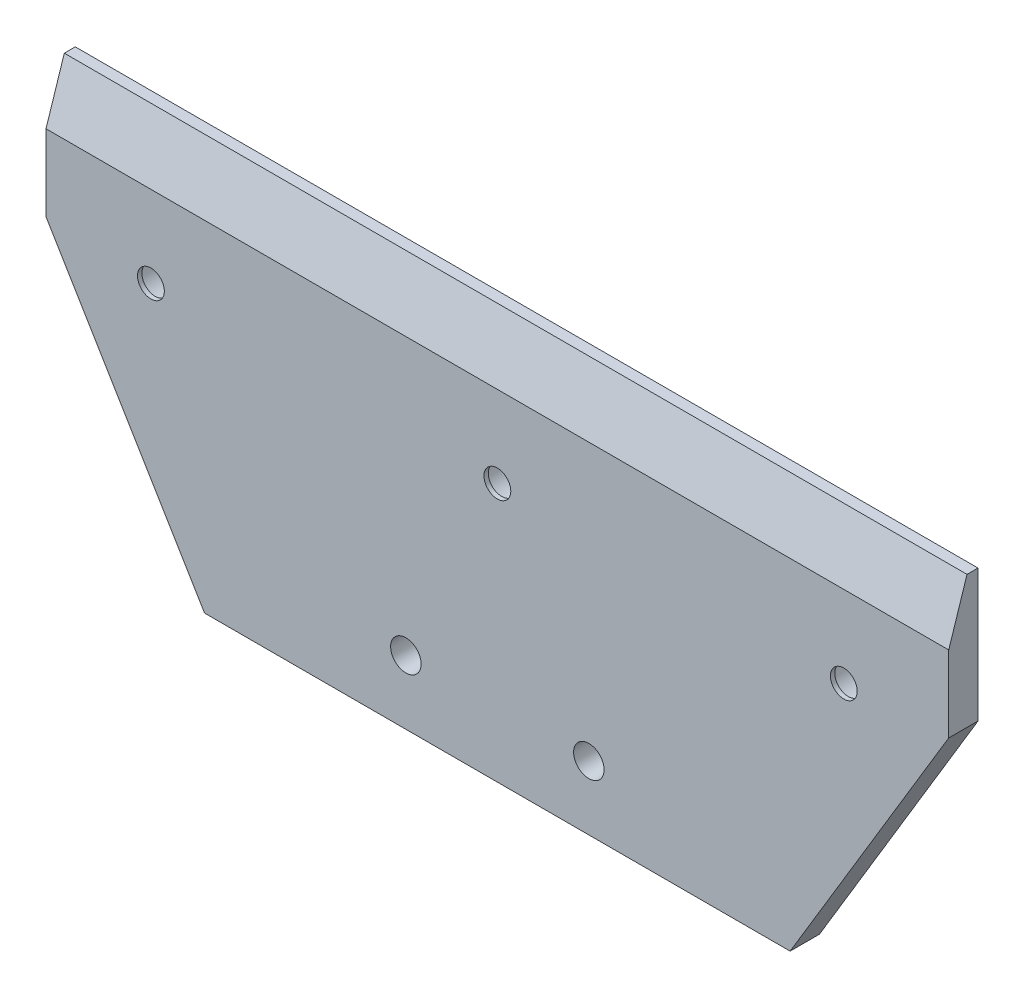
ISO-10303-21;
HEADER;
FILE_DESCRIPTION(('STEP AP214'),'2;1');
FILE_NAME('part.step','',(''),(''),'','','');
FILE_SCHEMA(('AUTOMOTIVE_DESIGN { 1 0 10303 214 1 1 1 1 }'));
ENDSEC;
DATA;
#1=APPLICATION_CONTEXT('core data for automotive mechanical design processes');
#2=APPLICATION_PROTOCOL_DEFINITION('international standard','automotive_design',2000,#1);
#3=PRODUCT_CONTEXT('',#1,'mechanical');
#4=PRODUCT('Part','Part','',(#3));
#5=PRODUCT_RELATED_PRODUCT_CATEGORY('part','',(#4));
#6=PRODUCT_DEFINITION_FORMATION('','',#4);
#7=PRODUCT_DEFINITION_CONTEXT('part definition',#1,'design');
#8=PRODUCT_DEFINITION('design','',#6,#7);
#9=PRODUCT_DEFINITION_SHAPE('','',#8);
#10=(LENGTH_UNIT() NAMED_UNIT(*) SI_UNIT(.MILLI.,.METRE.));
#11=(NAMED_UNIT(*) PLANE_ANGLE_UNIT() SI_UNIT($,.RADIAN.));
#12=(NAMED_UNIT(*) SI_UNIT($,.STERADIAN.) SOLID_ANGLE_UNIT());
#13=UNCERTAINTY_MEASURE_WITH_UNIT(LENGTH_MEASURE(1.E-05),#10,'distance_accuracy_value','');
#14=(GEOMETRIC_REPRESENTATION_CONTEXT(3) GLOBAL_UNCERTAINTY_ASSIGNED_CONTEXT((#13)) GLOBAL_UNIT_ASSIGNED_CONTEXT((#10,
#11,#12)) REPRESENTATION_CONTEXT('',''));
#15=CARTESIAN_POINT('',(0.,0.,0.));
#16=DIRECTION('',(0.,0.,1.));
#17=DIRECTION('',(1.,0.,0.));
#18=AXIS2_PLACEMENT_3D('',#15,#16,#17);
#19=CARTESIAN_POINT('',(0.,0.,-1.2));
#20=DIRECTION('',(0.,0.,1.));
#21=DIRECTION('',(1.,0.,0.));
#22=AXIS2_PLACEMENT_3D('',#19,#20,#21);
#23=PLANE('',#22);
#24=CARTESIAN_POINT('',(28.4,21.2,-1.2));
#25=DIRECTION('',(0.,0.,-1.));
#26=DIRECTION('',(-1.,0.,0.));
#27=AXIS2_PLACEMENT_3D('',#24,#25,#26);
#28=CIRCLE('',#27,2.);
#29=CARTESIAN_POINT('',(26.4,21.2,-1.2));
#30=VERTEX_POINT('',#29);
#31=EDGE_CURVE('E255',#30,#30,#28,.T.);
#32=ORIENTED_EDGE('',*,*,#31,.F.);
#33=EDGE_LOOP('',(#32));
#34=FACE_BOUND('',#33,.T.);
#35=CARTESIAN_POINT('',(-28.4,21.2,-1.2));
#36=DIRECTION('',(0.,0.,-1.));
#37=DIRECTION('',(-1.,0.,0.));
#38=AXIS2_PLACEMENT_3D('',#35,#36,#37);
#39=CIRCLE('',#38,2.);
#40=CARTESIAN_POINT('',(-30.4,21.2,-1.2));
#41=VERTEX_POINT('',#40);
#42=EDGE_CURVE('E235',#41,#41,#39,.T.);
#43=ORIENTED_EDGE('',*,*,#42,.F.);
#44=EDGE_LOOP('',(#43));
#45=FACE_BOUND('',#44,.T.);
#46=CARTESIAN_POINT('',(-7.5,5.25,-1.2));
#47=DIRECTION('',(0.,0.,1.));
#48=DIRECTION('',(1.,0.,0.));
#49=AXIS2_PLACEMENT_3D('',#46,#47,#48);
#50=CIRCLE('',#49,1.25);
#51=CARTESIAN_POINT('',(-6.25,5.25,-1.2));
#52=VERTEX_POINT('',#51);
#53=EDGE_CURVE('E44',#52,#52,#50,.T.);
#54=ORIENTED_EDGE('',*,*,#53,.T.);
#55=EDGE_LOOP('',(#54));
#56=FACE_BOUND('',#55,.T.);
#57=CARTESIAN_POINT('',(7.5,5.25,-1.2));
#58=DIRECTION('',(0.,0.,1.));
#59=DIRECTION('',(1.,0.,0.));
#60=AXIS2_PLACEMENT_3D('',#57,#58,#59);
#61=CIRCLE('',#60,1.25);
#62=CARTESIAN_POINT('',(8.75,5.25,-1.2));
#63=VERTEX_POINT('',#62);
#64=EDGE_CURVE('E220',#63,#63,#61,.T.);
#65=ORIENTED_EDGE('',*,*,#64,.T.);
#66=EDGE_LOOP('',(#65));
#67=FACE_BOUND('',#66,.T.);
#68=DIRECTION('',(0.515038074910052,-0.857167300702114,0.));
#69=VECTOR('',#68,1.);
#70=CARTESIAN_POINT('',(-37.,21.6356332705569,-1.2));
#71=LINE('',#70,#69);
#72=CARTESIAN_POINT('',(-37.,21.6356332705569,-1.2));
#73=VERTEX_POINT('',#72);
#74=CARTESIAN_POINT('',(-24.,0.,-1.2));
#75=VERTEX_POINT('',#74);
#76=EDGE_CURVE('E113',#73,#75,#71,.T.);
#77=ORIENTED_EDGE('',*,*,#76,.F.);
#78=DIRECTION('',(0.,-1.,0.));
#79=VECTOR('',#78,1.);
#80=CARTESIAN_POINT('',(-37.,32.5,-1.2));
#81=LINE('',#80,#79);
#82=CARTESIAN_POINT('',(-37.,32.5,-1.2));
#83=VERTEX_POINT('',#82);
#84=EDGE_CURVE('E91',#83,#73,#81,.T.);
#85=ORIENTED_EDGE('',*,*,#84,.F.);
#86=DIRECTION('',(-1.,0.,0.));
#87=VECTOR('',#86,1.);
#88=CARTESIAN_POINT('',(37.,32.5,-1.2));
#89=LINE('',#88,#87);
#90=CARTESIAN_POINT('',(37.,32.5,-1.2));
#91=VERTEX_POINT('',#90);
#92=EDGE_CURVE('E122',#91,#83,#89,.T.);
#93=ORIENTED_EDGE('',*,*,#92,.F.);
#94=DIRECTION('',(0.,1.,0.));
#95=VECTOR('',#94,1.);
#96=CARTESIAN_POINT('',(37.,21.6356332705569,-1.2));
#97=LINE('',#96,#95);
#98=CARTESIAN_POINT('',(37.,21.6356332705569,-1.2));
#99=VERTEX_POINT('',#98);
#100=EDGE_CURVE('E147',#99,#91,#97,.T.);
#101=ORIENTED_EDGE('',*,*,#100,.F.);
#102=DIRECTION('',(0.515038074910052,0.857167300702114,0.));
#103=VECTOR('',#102,1.);
#104=CARTESIAN_POINT('',(24.,0.,-1.2));
#105=LINE('',#104,#103);
#106=CARTESIAN_POINT('',(24.,0.,-1.2));
#107=VERTEX_POINT('',#106);
#108=EDGE_CURVE('E139',#107,#99,#105,.T.);
#109=ORIENTED_EDGE('',*,*,#108,.F.);
#110=DIRECTION('',(1.,0.,0.));
#111=VECTOR('',#110,1.);
#112=CARTESIAN_POINT('',(-24.,0.,-1.2));
#113=LINE('',#112,#111);
#114=EDGE_CURVE('E145',#75,#107,#113,.T.);
#115=ORIENTED_EDGE('',*,*,#114,.F.);
#116=EDGE_LOOP('',(#77,#85,#93,#101,#109,#115));
#117=FACE_BOUND('',#116,.T.);
#118=CARTESIAN_POINT('',(0.,21.2,-1.2));
#119=DIRECTION('',(0.,0.,-1.));
#120=DIRECTION('',(-1.,0.,0.));
#121=AXIS2_PLACEMENT_3D('',#118,#119,#120);
#122=CIRCLE('',#121,2.);
#123=CARTESIAN_POINT('',(-2.,21.2,-1.2));
#124=VERTEX_POINT('',#123);
#125=EDGE_CURVE('E245',#124,#124,#122,.T.);
#126=ORIENTED_EDGE('',*,*,#125,.F.);
#127=EDGE_LOOP('',(#126));
#128=FACE_BOUND('',#127,.T.);
#129=ADVANCED_FACE('F40',(#34,#45,#56,#67,#117,#128),#23,.F.);
#130=CARTESIAN_POINT('',(-37.,21.6356332705569,1.2));
#131=DIRECTION('',(0.857167300702114,0.515038074910052,0.));
#132=DIRECTION('',(-0.515038074910052,0.857167300702114,0.));
#133=AXIS2_PLACEMENT_3D('',#130,#131,#132);
#134=PLANE('',#133);
#135=ORIENTED_EDGE('',*,*,#76,.T.);
#136=DIRECTION('',(0.,0.,-1.));
#137=VECTOR('',#136,1.);
#138=CARTESIAN_POINT('',(-24.,0.,1.2));
#139=LINE('',#138,#137);
#140=CARTESIAN_POINT('',(-24.,0.,1.2));
#141=VERTEX_POINT('',#140);
#142=EDGE_CURVE('E11',#141,#75,#139,.T.);
#143=ORIENTED_EDGE('',*,*,#142,.F.);
#144=DIRECTION('',(0.515038074910052,-0.857167300702114,0.));
#145=VECTOR('',#144,1.);
#146=CARTESIAN_POINT('',(-37.,21.6356332705569,1.2));
#147=LINE('',#146,#145);
#148=CARTESIAN_POINT('',(-37.,21.6356332705569,1.2));
#149=VERTEX_POINT('',#148);
#150=EDGE_CURVE('E153',#149,#141,#147,.T.);
#151=ORIENTED_EDGE('',*,*,#150,.F.);
#152=DIRECTION('',(0.,0.,-1.));
#153=VECTOR('',#152,1.);
#154=CARTESIAN_POINT('',(-37.,21.6356332705569,1.2));
#155=LINE('',#154,#153);
#156=EDGE_CURVE('E124',#149,#73,#155,.T.);
#157=ORIENTED_EDGE('',*,*,#156,.T.);
#158=EDGE_LOOP('',(#135,#143,#151,#157));
#159=FACE_BOUND('',#158,.T.);
#160=ADVANCED_FACE('F42',(#159),#134,.F.);
#161=CARTESIAN_POINT('',(-24.,0.,1.2));
#162=DIRECTION('',(0.,1.,0.));
#163=DIRECTION('',(-1.,0.,0.));
#164=AXIS2_PLACEMENT_3D('',#161,#162,#163);
#165=PLANE('',#164);
#166=ORIENTED_EDGE('',*,*,#114,.T.);
#167=DIRECTION('',(0.,0.,-1.));
#168=VECTOR('',#167,1.);
#169=CARTESIAN_POINT('',(24.,0.,1.2));
#170=LINE('',#169,#168);
#171=CARTESIAN_POINT('',(24.,0.,1.2));
#172=VERTEX_POINT('',#171);
#173=EDGE_CURVE('E49',#172,#107,#170,.T.);
#174=ORIENTED_EDGE('',*,*,#173,.F.);
#175=DIRECTION('',(1.,0.,0.));
#176=VECTOR('',#175,1.);
#177=CARTESIAN_POINT('',(-24.,0.,1.2));
#178=LINE('',#177,#176);
#179=EDGE_CURVE('E98',#141,#172,#178,.T.);
#180=ORIENTED_EDGE('',*,*,#179,.F.);
#181=ORIENTED_EDGE('',*,*,#142,.T.);
#182=EDGE_LOOP('',(#166,#174,#180,#181));
#183=FACE_BOUND('',#182,.T.);
#184=ADVANCED_FACE('F166',(#183),#165,.F.);
#185=CARTESIAN_POINT('',(24.,0.,1.2));
#186=DIRECTION('',(-0.857167300702113,0.515038074910052,0.));
#187=DIRECTION('',(-0.515038074910052,-0.857167300702114,0.));
#188=AXIS2_PLACEMENT_3D('',#185,#186,#187);
#189=PLANE('',#188);
#190=ORIENTED_EDGE('',*,*,#108,.T.);
#191=DIRECTION('',(0.,0.,-1.));
#192=VECTOR('',#191,1.);
#193=CARTESIAN_POINT('',(37.,21.6356332705569,1.2));
#194=LINE('',#193,#192);
#195=CARTESIAN_POINT('',(37.,21.6356332705569,1.2));
#196=VERTEX_POINT('',#195);
#197=EDGE_CURVE('E126',#196,#99,#194,.T.);
#198=ORIENTED_EDGE('',*,*,#197,.F.);
#199=DIRECTION('',(0.515038074910052,0.857167300702114,0.));
#200=VECTOR('',#199,1.);
#201=CARTESIAN_POINT('',(24.,0.,1.2));
#202=LINE('',#201,#200);
#203=EDGE_CURVE('E140',#172,#196,#202,.T.);
#204=ORIENTED_EDGE('',*,*,#203,.F.);
#205=ORIENTED_EDGE('',*,*,#173,.T.);
#206=EDGE_LOOP('',(#190,#198,#204,#205));
#207=FACE_BOUND('',#206,.T.);
#208=ADVANCED_FACE('F137',(#207),#189,.F.);
#209=CARTESIAN_POINT('',(37.,21.6356332705569,1.2));
#210=DIRECTION('',(-1.,0.,0.));
#211=DIRECTION('',(0.,0.,1.));
#212=AXIS2_PLACEMENT_3D('',#209,#210,#211);
#213=PLANE('',#212);
#214=DIRECTION('',(0.,0.,-1.));
#215=VECTOR('',#214,1.);
#216=CARTESIAN_POINT('',(37.,32.5,1.2));
#217=LINE('',#216,#215);
#218=CARTESIAN_POINT('',(37.,32.5,-0.3));
#219=VERTEX_POINT('',#218);
#220=EDGE_CURVE('E123',#219,#91,#217,.T.);
#221=ORIENTED_EDGE('',*,*,#220,.F.);
#222=DIRECTION('',(0.,0.951056516295155,-0.309016994374942));
#223=VECTOR('',#222,1.);
#224=CARTESIAN_POINT('',(37.,27.883474694237,1.2));
#225=LINE('',#224,#223);
#226=CARTESIAN_POINT('',(37.,27.883474694237,1.2));
#227=VERTEX_POINT('',#226);
#228=EDGE_CURVE('E109',#227,#219,#225,.T.);
#229=ORIENTED_EDGE('',*,*,#228,.F.);
#230=DIRECTION('',(0.,1.,0.));
#231=VECTOR('',#230,1.);
#232=CARTESIAN_POINT('',(37.,21.6356332705569,1.2));
#233=LINE('',#232,#231);
#234=EDGE_CURVE('E161',#196,#227,#233,.T.);
#235=ORIENTED_EDGE('',*,*,#234,.F.);
#236=ORIENTED_EDGE('',*,*,#197,.T.);
#237=ORIENTED_EDGE('',*,*,#100,.T.);
#238=EDGE_LOOP('',(#221,#229,#235,#236,#237));
#239=FACE_BOUND('',#238,.T.);
#240=ADVANCED_FACE('F172',(#239),#213,.F.);
#241=CARTESIAN_POINT('',(37.,32.5,1.2));
#242=DIRECTION('',(0.,-1.,0.));
#243=DIRECTION('',(1.,0.,0.));
#244=AXIS2_PLACEMENT_3D('',#241,#242,#243);
#245=PLANE('',#244);
#246=DIRECTION('',(0.,0.,-1.));
#247=VECTOR('',#246,1.);
#248=CARTESIAN_POINT('',(-37.,32.5,1.2));
#249=LINE('',#248,#247);
#250=CARTESIAN_POINT('',(-37.,32.5,-0.3));
#251=VERTEX_POINT('',#250);
#252=EDGE_CURVE('E117',#251,#83,#249,.T.);
#253=ORIENTED_EDGE('',*,*,#252,.F.);
#254=DIRECTION('',(1.,0.,0.));
#255=VECTOR('',#254,1.);
#256=CARTESIAN_POINT('',(-37.,32.5,-0.3));
#257=LINE('',#256,#255);
#258=EDGE_CURVE('E106',#251,#219,#257,.T.);
#259=ORIENTED_EDGE('',*,*,#258,.T.);
#260=ORIENTED_EDGE('',*,*,#220,.T.);
#261=ORIENTED_EDGE('',*,*,#92,.T.);
#262=EDGE_LOOP('',(#253,#259,#260,#261));
#263=FACE_BOUND('',#262,.T.);
#264=ADVANCED_FACE('F120',(#263),#245,.F.);
#265=CARTESIAN_POINT('',(-37.,32.5,1.2));
#266=DIRECTION('',(1.,0.,0.));
#267=DIRECTION('',(0.,0.,-1.));
#268=AXIS2_PLACEMENT_3D('',#265,#266,#267);
#269=PLANE('',#268);
#270=DIRECTION('',(0.,-1.,0.));
#271=VECTOR('',#270,1.);
#272=CARTESIAN_POINT('',(-37.,32.5,1.2));
#273=LINE('',#272,#271);
#274=CARTESIAN_POINT('',(-37.,27.883474694237,1.2));
#275=VERTEX_POINT('',#274);
#276=EDGE_CURVE('E64',#275,#149,#273,.T.);
#277=ORIENTED_EDGE('',*,*,#276,.F.);
#278=DIRECTION('',(0.,0.951056516295155,-0.309016994374942));
#279=VECTOR('',#278,1.);
#280=CARTESIAN_POINT('',(-37.,27.883474694237,1.2));
#281=LINE('',#280,#279);
#282=EDGE_CURVE('E56',#275,#251,#281,.T.);
#283=ORIENTED_EDGE('',*,*,#282,.T.);
#284=ORIENTED_EDGE('',*,*,#252,.T.);
#285=ORIENTED_EDGE('',*,*,#84,.T.);
#286=ORIENTED_EDGE('',*,*,#156,.F.);
#287=EDGE_LOOP('',(#277,#283,#284,#285,#286));
#288=FACE_BOUND('',#287,.T.);
#289=ADVANCED_FACE('F116',(#288),#269,.F.);
#290=CARTESIAN_POINT('',(0.,0.,1.2));
#291=DIRECTION('',(0.,0.,1.));
#292=DIRECTION('',(1.,0.,0.));
#293=AXIS2_PLACEMENT_3D('',#290,#291,#292);
#294=PLANE('',#293);
#295=CARTESIAN_POINT('',(28.4,21.2,1.2));
#296=DIRECTION('',(0.,0.,1.));
#297=DIRECTION('',(1.,0.,0.));
#298=AXIS2_PLACEMENT_3D('',#295,#296,#297);
#299=CIRCLE('',#298,1.10000000000001);
#300=CARTESIAN_POINT('',(29.5,21.2,1.2));
#301=VERTEX_POINT('',#300);
#302=EDGE_CURVE('E203',#301,#301,#299,.T.);
#303=ORIENTED_EDGE('',*,*,#302,.F.);
#304=EDGE_LOOP('',(#303));
#305=FACE_BOUND('',#304,.T.);
#306=CARTESIAN_POINT('',(0.,21.2,1.2));
#307=DIRECTION('',(0.,0.,1.));
#308=DIRECTION('',(1.,0.,0.));
#309=AXIS2_PLACEMENT_3D('',#306,#307,#308);
#310=CIRCLE('',#309,1.10000000000001);
#311=CARTESIAN_POINT('',(1.10000000000001,21.2,1.2));
#312=VERTEX_POINT('',#311);
#313=EDGE_CURVE('E207',#312,#312,#310,.T.);
#314=ORIENTED_EDGE('',*,*,#313,.F.);
#315=EDGE_LOOP('',(#314));
#316=FACE_BOUND('',#315,.T.);
#317=CARTESIAN_POINT('',(-28.4,21.2,1.2));
#318=DIRECTION('',(0.,0.,1.));
#319=DIRECTION('',(1.,0.,0.));
#320=AXIS2_PLACEMENT_3D('',#317,#318,#319);
#321=CIRCLE('',#320,1.10000000000001);
#322=CARTESIAN_POINT('',(-27.3,21.2,1.2));
#323=VERTEX_POINT('',#322);
#324=EDGE_CURVE('E211',#323,#323,#321,.T.);
#325=ORIENTED_EDGE('',*,*,#324,.F.);
#326=EDGE_LOOP('',(#325));
#327=FACE_BOUND('',#326,.T.);
#328=CARTESIAN_POINT('',(-7.5,5.25,1.2));
#329=DIRECTION('',(0.,0.,1.));
#330=DIRECTION('',(1.,0.,0.));
#331=AXIS2_PLACEMENT_3D('',#328,#329,#330);
#332=CIRCLE('',#331,1.25);
#333=CARTESIAN_POINT('',(-6.25,5.25,1.2));
#334=VERTEX_POINT('',#333);
#335=EDGE_CURVE('E215',#334,#334,#332,.T.);
#336=ORIENTED_EDGE('',*,*,#335,.F.);
#337=EDGE_LOOP('',(#336));
#338=FACE_BOUND('',#337,.T.);
#339=CARTESIAN_POINT('',(7.5,5.25,1.2));
#340=DIRECTION('',(0.,0.,1.));
#341=DIRECTION('',(1.,0.,0.));
#342=AXIS2_PLACEMENT_3D('',#339,#340,#341);
#343=CIRCLE('',#342,1.25);
#344=CARTESIAN_POINT('',(8.75,5.25,1.2));
#345=VERTEX_POINT('',#344);
#346=EDGE_CURVE('E218',#345,#345,#343,.T.);
#347=ORIENTED_EDGE('',*,*,#346,.F.);
#348=EDGE_LOOP('',(#347));
#349=FACE_BOUND('',#348,.T.);
#350=DIRECTION('',(1.,0.,0.));
#351=VECTOR('',#350,1.);
#352=CARTESIAN_POINT('',(-37.,27.883474694237,1.2));
#353=LINE('',#352,#351);
#354=EDGE_CURVE('E114',#275,#227,#353,.T.);
#355=ORIENTED_EDGE('',*,*,#354,.F.);
#356=ORIENTED_EDGE('',*,*,#276,.T.);
#357=ORIENTED_EDGE('',*,*,#150,.T.);
#358=ORIENTED_EDGE('',*,*,#179,.T.);
#359=ORIENTED_EDGE('',*,*,#203,.T.);
#360=ORIENTED_EDGE('',*,*,#234,.T.);
#361=EDGE_LOOP('',(#355,#356,#357,#358,#359,#360));
#362=FACE_BOUND('',#361,.T.);
#363=ADVANCED_FACE('F183',(#305,#316,#327,#338,#349,#362),#294,.T.);
#364=CARTESIAN_POINT('',(-37.,27.883474694237,1.2));
#365=DIRECTION('',(0.,-0.309016994374942,-0.951056516295156));
#366=DIRECTION('',(0.,0.951056516295156,-0.309016994374942));
#367=AXIS2_PLACEMENT_3D('',#364,#365,#366);
#368=PLANE('',#367);
#369=ORIENTED_EDGE('',*,*,#228,.T.);
#370=ORIENTED_EDGE('',*,*,#258,.F.);
#371=ORIENTED_EDGE('',*,*,#282,.F.);
#372=ORIENTED_EDGE('',*,*,#354,.T.);
#373=EDGE_LOOP('',(#369,#370,#371,#372));
#374=FACE_BOUND('',#373,.T.);
#375=ADVANCED_FACE('F107',(#374),#368,.F.);
#376=CARTESIAN_POINT('',(7.5,5.25,1.2));
#377=DIRECTION('',(0.,0.,1.));
#378=DIRECTION('',(1.,0.,0.));
#379=AXIS2_PLACEMENT_3D('',#376,#377,#378);
#380=CYLINDRICAL_SURFACE('',#379,1.25);
#381=ORIENTED_EDGE('',*,*,#346,.T.);
#382=EDGE_LOOP('',(#381));
#383=FACE_BOUND('',#382,.T.);
#384=ORIENTED_EDGE('',*,*,#64,.F.);
#385=EDGE_LOOP('',(#384));
#386=FACE_BOUND('',#385,.T.);
#387=ADVANCED_FACE('F199',(#383,#386),#380,.F.);
#388=CARTESIAN_POINT('',(-7.5,5.25,1.2));
#389=DIRECTION('',(0.,0.,1.));
#390=DIRECTION('',(1.,0.,0.));
#391=AXIS2_PLACEMENT_3D('',#388,#389,#390);
#392=CYLINDRICAL_SURFACE('',#391,1.25);
#393=ORIENTED_EDGE('',*,*,#335,.T.);
#394=EDGE_LOOP('',(#393));
#395=FACE_BOUND('',#394,.T.);
#396=ORIENTED_EDGE('',*,*,#53,.F.);
#397=EDGE_LOOP('',(#396));
#398=FACE_BOUND('',#397,.T.);
#399=ADVANCED_FACE('F297',(#395,#398),#392,.F.);
#400=CARTESIAN_POINT('',(-28.4,21.2,-1.2));
#401=DIRECTION('',(0.,0.,-1.));
#402=DIRECTION('',(-1.,0.,0.));
#403=AXIS2_PLACEMENT_3D('',#400,#401,#402);
#404=CYLINDRICAL_SURFACE('',#403,1.10000000000001);
#405=CARTESIAN_POINT('',(-28.4,21.2,0.8407745571248));
#406=DIRECTION('',(0.,0.,-1.));
#407=DIRECTION('',(-1.,0.,0.));
#408=AXIS2_PLACEMENT_3D('',#405,#406,#407);
#409=CIRCLE('',#408,1.10000000000001);
#410=CARTESIAN_POINT('',(-29.5,21.2,0.8407745571248));
#411=VERTEX_POINT('',#410);
#412=EDGE_CURVE('E229',#411,#411,#409,.T.);
#413=ORIENTED_EDGE('',*,*,#412,.T.);
#414=EDGE_LOOP('',(#413));
#415=FACE_BOUND('',#414,.T.);
#416=ORIENTED_EDGE('',*,*,#324,.T.);
#417=EDGE_LOOP('',(#416));
#418=FACE_BOUND('',#417,.T.);
#419=ADVANCED_FACE('F293',(#415,#418),#404,.F.);
#420=CARTESIAN_POINT('',(-28.4,21.2,0.300000000000001));
#421=DIRECTION('',(0.,0.,-1.));
#422=DIRECTION('',(-1.,0.,0.));
#423=AXIS2_PLACEMENT_3D('',#420,#421,#422);
#424=CONICAL_SURFACE('',#423,2.,1.02974425867665);
#425=ORIENTED_EDGE('',*,*,#412,.F.);
#426=EDGE_LOOP('',(#425));
#427=FACE_BOUND('',#426,.T.);
#428=CARTESIAN_POINT('',(-28.4,21.2,0.300000000000001));
#429=DIRECTION('',(0.,0.,-1.));
#430=DIRECTION('',(-1.,0.,0.));
#431=AXIS2_PLACEMENT_3D('',#428,#429,#430);
#432=CIRCLE('',#431,2.);
#433=CARTESIAN_POINT('',(-30.4,21.2,0.300000000000001));
#434=VERTEX_POINT('',#433);
#435=EDGE_CURVE('E232',#434,#434,#432,.T.);
#436=ORIENTED_EDGE('',*,*,#435,.T.);
#437=EDGE_LOOP('',(#436));
#438=FACE_BOUND('',#437,.T.);
#439=ADVANCED_FACE('F289',(#427,#438),#424,.F.);
#440=CARTESIAN_POINT('',(-28.4,21.2,-1.2));
#441=DIRECTION('',(0.,0.,-1.));
#442=DIRECTION('',(-1.,0.,0.));
#443=AXIS2_PLACEMENT_3D('',#440,#441,#442);
#444=CYLINDRICAL_SURFACE('',#443,2.);
#445=ORIENTED_EDGE('',*,*,#435,.F.);
#446=EDGE_LOOP('',(#445));
#447=FACE_BOUND('',#446,.T.);
#448=ORIENTED_EDGE('',*,*,#42,.T.);
#449=EDGE_LOOP('',(#448));
#450=FACE_BOUND('',#449,.T.);
#451=ADVANCED_FACE('F285',(#447,#450),#444,.F.);
#452=CARTESIAN_POINT('',(0.,21.2,-1.2));
#453=DIRECTION('',(0.,0.,-1.));
#454=DIRECTION('',(-1.,0.,0.));
#455=AXIS2_PLACEMENT_3D('',#452,#453,#454);
#456=CYLINDRICAL_SURFACE('',#455,1.10000000000001);
#457=CARTESIAN_POINT('',(0.,21.2,0.8407745571248));
#458=DIRECTION('',(0.,0.,-1.));
#459=DIRECTION('',(-1.,0.,0.));
#460=AXIS2_PLACEMENT_3D('',#457,#458,#459);
#461=CIRCLE('',#460,1.10000000000001);
#462=CARTESIAN_POINT('',(-1.10000000000001,21.2,0.8407745571248));
#463=VERTEX_POINT('',#462);
#464=EDGE_CURVE('E239',#463,#463,#461,.T.);
#465=ORIENTED_EDGE('',*,*,#464,.T.);
#466=EDGE_LOOP('',(#465));
#467=FACE_BOUND('',#466,.T.);
#468=ORIENTED_EDGE('',*,*,#313,.T.);
#469=EDGE_LOOP('',(#468));
#470=FACE_BOUND('',#469,.T.);
#471=ADVANCED_FACE('F281',(#467,#470),#456,.F.);
#472=CARTESIAN_POINT('',(0.,21.2,0.300000000000001));
#473=DIRECTION('',(0.,0.,-1.));
#474=DIRECTION('',(-1.,0.,0.));
#475=AXIS2_PLACEMENT_3D('',#472,#473,#474);
#476=CONICAL_SURFACE('',#475,2.,1.02974425867665);
#477=ORIENTED_EDGE('',*,*,#464,.F.);
#478=EDGE_LOOP('',(#477));
#479=FACE_BOUND('',#478,.T.);
#480=CARTESIAN_POINT('',(0.,21.2,0.300000000000001));
#481=DIRECTION('',(0.,0.,-1.));
#482=DIRECTION('',(-1.,0.,0.));
#483=AXIS2_PLACEMENT_3D('',#480,#481,#482);
#484=CIRCLE('',#483,2.);
#485=CARTESIAN_POINT('',(-2.,21.2,0.300000000000001));
#486=VERTEX_POINT('',#485);
#487=EDGE_CURVE('E242',#486,#486,#484,.T.);
#488=ORIENTED_EDGE('',*,*,#487,.T.);
#489=EDGE_LOOP('',(#488));
#490=FACE_BOUND('',#489,.T.);
#491=ADVANCED_FACE('F277',(#479,#490),#476,.F.);
#492=CARTESIAN_POINT('',(0.,21.2,-1.2));
#493=DIRECTION('',(0.,0.,-1.));
#494=DIRECTION('',(-1.,0.,0.));
#495=AXIS2_PLACEMENT_3D('',#492,#493,#494);
#496=CYLINDRICAL_SURFACE('',#495,2.);
#497=ORIENTED_EDGE('',*,*,#487,.F.);
#498=EDGE_LOOP('',(#497));
#499=FACE_BOUND('',#498,.T.);
#500=ORIENTED_EDGE('',*,*,#125,.T.);
#501=EDGE_LOOP('',(#500));
#502=FACE_BOUND('',#501,.T.);
#503=ADVANCED_FACE('F273',(#499,#502),#496,.F.);
#504=CARTESIAN_POINT('',(28.4,21.2,-1.2));
#505=DIRECTION('',(0.,0.,-1.));
#506=DIRECTION('',(-1.,0.,0.));
#507=AXIS2_PLACEMENT_3D('',#504,#505,#506);
#508=CYLINDRICAL_SURFACE('',#507,1.10000000000001);
#509=CARTESIAN_POINT('',(28.4,21.2,0.8407745571248));
#510=DIRECTION('',(0.,0.,-1.));
#511=DIRECTION('',(-1.,0.,0.));
#512=AXIS2_PLACEMENT_3D('',#509,#510,#511);
#513=CIRCLE('',#512,1.10000000000001);
#514=CARTESIAN_POINT('',(27.3,21.2,0.8407745571248));
#515=VERTEX_POINT('',#514);
#516=EDGE_CURVE('E249',#515,#515,#513,.T.);
#517=ORIENTED_EDGE('',*,*,#516,.T.);
#518=EDGE_LOOP('',(#517));
#519=FACE_BOUND('',#518,.T.);
#520=ORIENTED_EDGE('',*,*,#302,.T.);
#521=EDGE_LOOP('',(#520));
#522=FACE_BOUND('',#521,.T.);
#523=ADVANCED_FACE('F266',(#519,#522),#508,.F.);
#524=CARTESIAN_POINT('',(28.4,21.2,0.300000000000001));
#525=DIRECTION('',(0.,0.,-1.));
#526=DIRECTION('',(-1.,0.,0.));
#527=AXIS2_PLACEMENT_3D('',#524,#525,#526);
#528=CONICAL_SURFACE('',#527,2.,1.02974425867665);
#529=ORIENTED_EDGE('',*,*,#516,.F.);
#530=EDGE_LOOP('',(#529));
#531=FACE_BOUND('',#530,.T.);
#532=CARTESIAN_POINT('',(28.4,21.2,0.300000000000001));
#533=DIRECTION('',(0.,0.,-1.));
#534=DIRECTION('',(-1.,0.,0.));
#535=AXIS2_PLACEMENT_3D('',#532,#533,#534);
#536=CIRCLE('',#535,2.);
#537=CARTESIAN_POINT('',(26.4,21.2,0.300000000000001));
#538=VERTEX_POINT('',#537);
#539=EDGE_CURVE('E252',#538,#538,#536,.T.);
#540=ORIENTED_EDGE('',*,*,#539,.T.);
#541=EDGE_LOOP('',(#540));
#542=FACE_BOUND('',#541,.T.);
#543=ADVANCED_FACE('F260',(#531,#542),#528,.F.);
#544=CARTESIAN_POINT('',(28.4,21.2,-1.2));
#545=DIRECTION('',(0.,0.,-1.));
#546=DIRECTION('',(-1.,0.,0.));
#547=AXIS2_PLACEMENT_3D('',#544,#545,#546);
#548=CYLINDRICAL_SURFACE('',#547,2.);
#549=ORIENTED_EDGE('',*,*,#539,.F.);
#550=EDGE_LOOP('',(#549));
#551=FACE_BOUND('',#550,.T.);
#552=ORIENTED_EDGE('',*,*,#31,.T.);
#553=EDGE_LOOP('',(#552));
#554=FACE_BOUND('',#553,.T.);
#555=ADVANCED_FACE('F258',(#551,#554),#548,.F.);
#556=CLOSED_SHELL('',(#129,#160,#184,#208,#240,#264,#289,#363,#375,#387,#399,#419,#439,#451,
#471,#491,#503,#523,#543,#555));
#557=MANIFOLD_SOLID_BREP('B2',#556);
#558=ADVANCED_BREP_SHAPE_REPRESENTATION('',(#18,#557),#14);
#559=SHAPE_DEFINITION_REPRESENTATION(#9,#558);
ENDSEC;
END-ISO-10303-21;
